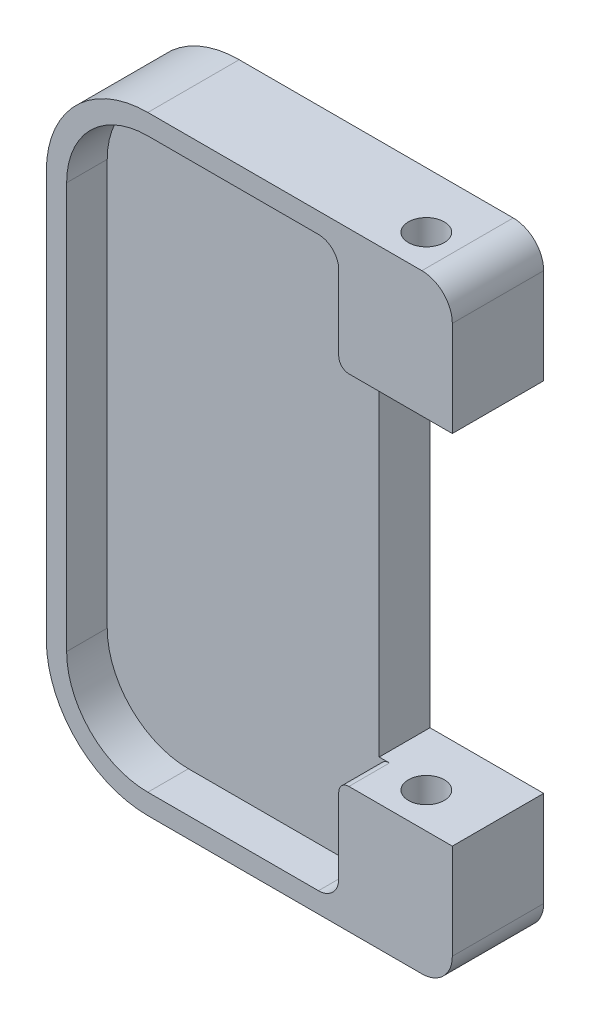
ISO-10303-21;
HEADER;
FILE_DESCRIPTION(('STEP AP214'),'2;1');
FILE_NAME('part.step','',(''),(''),'','','');
FILE_SCHEMA(('AUTOMOTIVE_DESIGN { 1 0 10303 214 1 1 1 1 }'));
ENDSEC;
DATA;
#1=APPLICATION_CONTEXT('core data for automotive mechanical design processes');
#2=APPLICATION_PROTOCOL_DEFINITION('international standard','automotive_design',2000,#1);
#3=PRODUCT_CONTEXT('',#1,'mechanical');
#4=PRODUCT('Part','Part','',(#3));
#5=PRODUCT_RELATED_PRODUCT_CATEGORY('part','',(#4));
#6=PRODUCT_DEFINITION_FORMATION('','',#4);
#7=PRODUCT_DEFINITION_CONTEXT('part definition',#1,'design');
#8=PRODUCT_DEFINITION('design','',#6,#7);
#9=PRODUCT_DEFINITION_SHAPE('','',#8);
#10=(LENGTH_UNIT() NAMED_UNIT(*) SI_UNIT(.MILLI.,.METRE.));
#11=(NAMED_UNIT(*) PLANE_ANGLE_UNIT() SI_UNIT($,.RADIAN.));
#12=(NAMED_UNIT(*) SI_UNIT($,.STERADIAN.) SOLID_ANGLE_UNIT());
#13=UNCERTAINTY_MEASURE_WITH_UNIT(LENGTH_MEASURE(1.E-05),#10,'distance_accuracy_value','');
#14=(GEOMETRIC_REPRESENTATION_CONTEXT(3) GLOBAL_UNCERTAINTY_ASSIGNED_CONTEXT((#13)) GLOBAL_UNIT_ASSIGNED_CONTEXT((#10,
#11,#12)) REPRESENTATION_CONTEXT('',''));
#15=CARTESIAN_POINT('',(0.,0.,0.));
#16=DIRECTION('',(0.,0.,1.));
#17=DIRECTION('',(1.,0.,0.));
#18=AXIS2_PLACEMENT_3D('',#15,#16,#17);
#19=CARTESIAN_POINT('',(0.,35.56,27.94));
#20=DIRECTION('',(0.,1.,0.));
#21=DIRECTION('',(0.,0.,1.));
#22=AXIS2_PLACEMENT_3D('',#19,#20,#21);
#23=PLANE('',#22);
#24=DIRECTION('',(-1.,0.,0.));
#25=VECTOR('',#24,1.);
#26=CARTESIAN_POINT('',(-76.2,35.56,25.4));
#27=LINE('',#26,#25);
#28=CARTESIAN_POINT('',(-54.8510226021288,35.56,25.4));
#29=VERTEX_POINT('',#28);
#30=CARTESIAN_POINT('',(-76.2,35.56,25.4));
#31=VERTEX_POINT('',#30);
#32=EDGE_CURVE('E304',#29,#31,#27,.T.);
#33=ORIENTED_EDGE('',*,*,#32,.F.);
#34=DIRECTION('',(0.,0.,-1.));
#35=VECTOR('',#34,1.);
#36=CARTESIAN_POINT('',(-54.8510226021288,35.56,30.48));
#37=LINE('',#36,#35);
#38=CARTESIAN_POINT('',(-54.8510226021288,35.56,30.48));
#39=VERTEX_POINT('',#38);
#40=EDGE_CURVE('E506',#29,#39,#37,.F.);
#41=ORIENTED_EDGE('',*,*,#40,.T.);
#42=DIRECTION('',(-1.,0.,0.));
#43=VECTOR('',#42,1.);
#44=CARTESIAN_POINT('',(0.,35.56,30.48));
#45=LINE('',#44,#43);
#46=CARTESIAN_POINT('',(-76.2,35.56,30.48));
#47=VERTEX_POINT('',#46);
#48=EDGE_CURVE('E399',#39,#47,#45,.T.);
#49=ORIENTED_EDGE('',*,*,#48,.T.);
#50=DIRECTION('',(0.,0.,1.));
#51=VECTOR('',#50,1.);
#52=CARTESIAN_POINT('',(-76.2,35.56,27.94));
#53=LINE('',#52,#51);
#54=EDGE_CURVE('E411',#31,#47,#53,.T.);
#55=ORIENTED_EDGE('',*,*,#54,.F.);
#56=EDGE_LOOP('',(#33,#41,#49,#55));
#57=FACE_BOUND('',#56,.T.);
#58=ADVANCED_FACE('F49',(#57),#23,.F.);
#59=CARTESIAN_POINT('',(-76.2,-25.4,25.4));
#60=DIRECTION('',(0.,0.,-1.));
#61=DIRECTION('',(-1.,0.,0.));
#62=AXIS2_PLACEMENT_3D('',#59,#60,#61);
#63=PLANE('',#62);
#64=DIRECTION('',(1.,0.,0.));
#65=VECTOR('',#64,1.);
#66=CARTESIAN_POINT('',(-50.9521226021288,-35.56,25.4));
#67=LINE('',#66,#65);
#68=CARTESIAN_POINT('',(-76.1999999999999,-35.56,25.4));
#69=VERTEX_POINT('',#68);
#70=CARTESIAN_POINT('',(-54.8510226021288,-35.56,25.4));
#71=VERTEX_POINT('',#70);
#72=EDGE_CURVE('E319',#69,#71,#67,.T.);
#73=ORIENTED_EDGE('',*,*,#72,.T.);
#74=CARTESIAN_POINT('',(-54.8510226021288,-33.02,25.4));
#75=DIRECTION('',(0.,0.,-1.));
#76=DIRECTION('',(-1.,0.,0.));
#77=AXIS2_PLACEMENT_3D('',#74,#75,#76);
#78=CIRCLE('',#77,2.54);
#79=CARTESIAN_POINT('',(-52.3110226021288,-33.02,25.4));
#80=VERTEX_POINT('',#79);
#81=EDGE_CURVE('E498',#71,#80,#78,.F.);
#82=ORIENTED_EDGE('',*,*,#81,.T.);
#83=DIRECTION('',(0.,-1.,0.));
#84=VECTOR('',#83,1.);
#85=CARTESIAN_POINT('',(-52.3110226021288,-22.352,25.4));
#86=LINE('',#85,#84);
#87=CARTESIAN_POINT('',(-52.3110226021288,-23.622,25.4));
#88=VERTEX_POINT('',#87);
#89=EDGE_CURVE('E540',#88,#80,#86,.T.);
#90=ORIENTED_EDGE('',*,*,#89,.F.);
#91=CARTESIAN_POINT('',(-51.0410226021288,-23.622,25.4));
#92=DIRECTION('',(0.,0.,-1.));
#93=DIRECTION('',(-1.,0.,0.));
#94=AXIS2_PLACEMENT_3D('',#91,#92,#93);
#95=CIRCLE('',#94,1.27);
#96=CARTESIAN_POINT('',(-51.0410226021288,-22.352,25.4));
#97=VERTEX_POINT('',#96);
#98=EDGE_CURVE('E58',#88,#97,#95,.T.);
#99=ORIENTED_EDGE('',*,*,#98,.T.);
#100=DIRECTION('',(-1.,0.,0.));
#101=VECTOR('',#100,1.);
#102=CARTESIAN_POINT('',(-50.9521226021288,-22.352,25.4));
#103=LINE('',#102,#101);
#104=CARTESIAN_POINT('',(-52.324,-22.352,25.4));
#105=VERTEX_POINT('',#104);
#106=EDGE_CURVE('E299',#97,#105,#103,.T.);
#107=ORIENTED_EDGE('',*,*,#106,.T.);
#108=DIRECTION('',(0.,-1.,0.));
#109=VECTOR('',#108,1.);
#110=CARTESIAN_POINT('',(-52.324,22.352,25.4));
#111=LINE('',#110,#109);
#112=CARTESIAN_POINT('',(-52.324,22.352,25.4));
#113=VERTEX_POINT('',#112);
#114=EDGE_CURVE('E289',#113,#105,#111,.T.);
#115=ORIENTED_EDGE('',*,*,#114,.F.);
#116=DIRECTION('',(1.,0.,0.));
#117=VECTOR('',#116,1.);
#118=CARTESIAN_POINT('',(-50.9521226021288,22.352,25.4));
#119=LINE('',#118,#117);
#120=CARTESIAN_POINT('',(-51.0410226021288,22.352,25.4));
#121=VERTEX_POINT('',#120);
#122=EDGE_CURVE('E64',#113,#121,#119,.T.);
#123=ORIENTED_EDGE('',*,*,#122,.T.);
#124=CARTESIAN_POINT('',(-51.0410226021288,23.622,25.4));
#125=DIRECTION('',(0.,0.,-1.));
#126=DIRECTION('',(-1.,0.,0.));
#127=AXIS2_PLACEMENT_3D('',#124,#125,#126);
#128=CIRCLE('',#127,1.27);
#129=CARTESIAN_POINT('',(-52.3110226021288,23.622,25.4));
#130=VERTEX_POINT('',#129);
#131=EDGE_CURVE('E12',#121,#130,#128,.T.);
#132=ORIENTED_EDGE('',*,*,#131,.T.);
#133=DIRECTION('',(0.,-1.,0.));
#134=VECTOR('',#133,1.);
#135=CARTESIAN_POINT('',(-52.3110226021288,35.56,25.4));
#136=LINE('',#135,#134);
#137=CARTESIAN_POINT('',(-52.3110226021288,33.02,25.4));
#138=VERTEX_POINT('',#137);
#139=EDGE_CURVE('E266',#138,#130,#136,.T.);
#140=ORIENTED_EDGE('',*,*,#139,.F.);
#141=CARTESIAN_POINT('',(-54.8510226021288,33.02,25.4));
#142=DIRECTION('',(0.,0.,-1.));
#143=DIRECTION('',(-1.,0.,0.));
#144=AXIS2_PLACEMENT_3D('',#141,#142,#143);
#145=CIRCLE('',#144,2.54);
#146=EDGE_CURVE('E495',#138,#29,#145,.F.);
#147=ORIENTED_EDGE('',*,*,#146,.T.);
#148=ORIENTED_EDGE('',*,*,#32,.T.);
#149=CARTESIAN_POINT('',(-76.2,25.4,25.4));
#150=DIRECTION('',(0.,0.,1.));
#151=DIRECTION('',(1.,0.,0.));
#152=AXIS2_PLACEMENT_3D('',#149,#150,#151);
#153=CIRCLE('',#152,10.16);
#154=CARTESIAN_POINT('',(-86.36,25.3999999999999,25.4));
#155=VERTEX_POINT('',#154);
#156=EDGE_CURVE('E307',#31,#155,#153,.T.);
#157=ORIENTED_EDGE('',*,*,#156,.T.);
#158=DIRECTION('',(0.,-1.,0.));
#159=VECTOR('',#158,1.);
#160=CARTESIAN_POINT('',(-86.36,25.3999999999999,25.4));
#161=LINE('',#160,#159);
#162=CARTESIAN_POINT('',(-86.36,-25.4,25.4));
#163=VERTEX_POINT('',#162);
#164=EDGE_CURVE('E311',#155,#163,#161,.T.);
#165=ORIENTED_EDGE('',*,*,#164,.T.);
#166=CARTESIAN_POINT('',(-76.2,-25.4,25.4));
#167=DIRECTION('',(0.,0.,1.));
#168=DIRECTION('',(-1.,0.,0.));
#169=AXIS2_PLACEMENT_3D('',#166,#167,#168);
#170=CIRCLE('',#169,10.16);
#171=EDGE_CURVE('E315',#163,#69,#170,.T.);
#172=ORIENTED_EDGE('',*,*,#171,.T.);
#173=EDGE_LOOP('',(#73,#82,#90,#99,#107,#115,#123,#132,#140,#147,#148,#157,#165,#172));
#174=FACE_BOUND('',#173,.T.);
#175=ADVANCED_FACE('F539',(#174),#63,.F.);
#176=CARTESIAN_POINT('',(0.,-22.352,21.59));
#177=DIRECTION('',(0.,1.,0.));
#178=DIRECTION('',(0.,0.,1.));
#179=AXIS2_PLACEMENT_3D('',#176,#177,#178);
#180=PLANE('',#179);
#181=ORIENTED_EDGE('',*,*,#106,.F.);
#182=DIRECTION('',(0.,0.,-1.));
#183=VECTOR('',#182,1.);
#184=CARTESIAN_POINT('',(-51.0410226021288,-22.352,21.59));
#185=LINE('',#184,#183);
#186=CARTESIAN_POINT('',(-51.0410226021288,-22.352,30.48));
#187=VERTEX_POINT('',#186);
#188=EDGE_CURVE('E520',#97,#187,#185,.F.);
#189=ORIENTED_EDGE('',*,*,#188,.T.);
#190=DIRECTION('',(-1.,0.,0.));
#191=VECTOR('',#190,1.);
#192=CARTESIAN_POINT('',(0.,-22.352,30.48));
#193=LINE('',#192,#191);
#194=CARTESIAN_POINT('',(-38.1,-22.352,30.48));
#195=VERTEX_POINT('',#194);
#196=EDGE_CURVE('E354',#195,#187,#193,.T.);
#197=ORIENTED_EDGE('',*,*,#196,.F.);
#198=DIRECTION('',(0.,0.,1.));
#199=VECTOR('',#198,1.);
#200=CARTESIAN_POINT('',(-38.1,-22.352,21.59));
#201=LINE('',#200,#199);
#202=CARTESIAN_POINT('',(-38.1,-22.352,19.05));
#203=VERTEX_POINT('',#202);
#204=EDGE_CURVE('E364',#203,#195,#201,.T.);
#205=ORIENTED_EDGE('',*,*,#204,.F.);
#206=DIRECTION('',(1.,0.,0.));
#207=VECTOR('',#206,1.);
#208=CARTESIAN_POINT('',(-52.324,-22.352,19.05));
#209=LINE('',#208,#207);
#210=CARTESIAN_POINT('',(-52.324,-22.352,19.05));
#211=VERTEX_POINT('',#210);
#212=EDGE_CURVE('E258',#211,#203,#209,.T.);
#213=ORIENTED_EDGE('',*,*,#212,.F.);
#214=DIRECTION('',(0.,0.,-1.));
#215=VECTOR('',#214,1.);
#216=CARTESIAN_POINT('',(-52.324,-22.352,25.4));
#217=LINE('',#216,#215);
#218=EDGE_CURVE('E293',#105,#211,#217,.T.);
#219=ORIENTED_EDGE('',*,*,#218,.F.);
#220=EDGE_LOOP('',(#181,#189,#197,#205,#213,#219));
#221=FACE_BOUND('',#220,.T.);
#222=CARTESIAN_POINT('',(-45.7960613010644,-22.352,26.035));
#223=DIRECTION('',(0.,1.,0.));
#224=DIRECTION('',(0.,0.,1.));
#225=AXIS2_PLACEMENT_3D('',#222,#223,#224);
#226=CIRCLE('',#225,2.2479);
#227=CARTESIAN_POINT('',(-45.7960613010644,-22.352,28.2829));
#228=VERTEX_POINT('',#227);
#229=EDGE_CURVE('E376',#228,#228,#226,.F.);
#230=ORIENTED_EDGE('',*,*,#229,.T.);
#231=EDGE_LOOP('',(#230));
#232=FACE_BOUND('',#231,.T.);
#233=ADVANCED_FACE('F546',(#221,#232),#180,.T.);
#234=CARTESIAN_POINT('',(0.,22.352,21.59));
#235=DIRECTION('',(0.,1.,0.));
#236=DIRECTION('',(-1.,0.,0.));
#237=AXIS2_PLACEMENT_3D('',#234,#235,#236);
#238=PLANE('',#237);
#239=DIRECTION('',(-1.,0.,0.));
#240=VECTOR('',#239,1.);
#241=CARTESIAN_POINT('',(0.,22.352,30.48));
#242=LINE('',#241,#240);
#243=CARTESIAN_POINT('',(-38.1,22.352,30.48));
#244=VERTEX_POINT('',#243);
#245=CARTESIAN_POINT('',(-51.0410226021288,22.352,30.48));
#246=VERTEX_POINT('',#245);
#247=EDGE_CURVE('E360',#244,#246,#242,.T.);
#248=ORIENTED_EDGE('',*,*,#247,.T.);
#249=DIRECTION('',(0.,0.,1.));
#250=VECTOR('',#249,1.);
#251=CARTESIAN_POINT('',(-51.0410226021288,22.352,21.59));
#252=LINE('',#251,#250);
#253=EDGE_CURVE('E533',#246,#121,#252,.F.);
#254=ORIENTED_EDGE('',*,*,#253,.T.);
#255=ORIENTED_EDGE('',*,*,#122,.F.);
#256=DIRECTION('',(0.,0.,1.));
#257=VECTOR('',#256,1.);
#258=CARTESIAN_POINT('',(-52.324,22.352,21.59));
#259=LINE('',#258,#257);
#260=CARTESIAN_POINT('',(-52.324,22.352,19.05));
#261=VERTEX_POINT('',#260);
#262=EDGE_CURVE('E286',#261,#113,#259,.T.);
#263=ORIENTED_EDGE('',*,*,#262,.F.);
#264=DIRECTION('',(-1.,0.,0.));
#265=VECTOR('',#264,1.);
#266=CARTESIAN_POINT('',(-38.1,22.352,19.05));
#267=LINE('',#266,#265);
#268=CARTESIAN_POINT('',(-38.1,22.352,19.05));
#269=VERTEX_POINT('',#268);
#270=EDGE_CURVE('E278',#269,#261,#267,.T.);
#271=ORIENTED_EDGE('',*,*,#270,.F.);
#272=DIRECTION('',(0.,0.,1.));
#273=VECTOR('',#272,1.);
#274=CARTESIAN_POINT('',(-38.1,22.352,21.59));
#275=LINE('',#274,#273);
#276=EDGE_CURVE('E365',#269,#244,#275,.T.);
#277=ORIENTED_EDGE('',*,*,#276,.T.);
#278=EDGE_LOOP('',(#248,#254,#255,#263,#271,#277));
#279=FACE_BOUND('',#278,.T.);
#280=CARTESIAN_POINT('',(-45.7960613010644,22.352,26.035));
#281=DIRECTION('',(0.,1.,0.));
#282=DIRECTION('',(-1.,0.,0.));
#283=AXIS2_PLACEMENT_3D('',#280,#281,#282);
#284=CIRCLE('',#283,2.2479);
#285=CARTESIAN_POINT('',(-48.0439613010644,22.352,26.035));
#286=VERTEX_POINT('',#285);
#287=EDGE_CURVE('E368',#286,#286,#284,.F.);
#288=ORIENTED_EDGE('',*,*,#287,.F.);
#289=EDGE_LOOP('',(#288));
#290=FACE_BOUND('',#289,.T.);
#291=ADVANCED_FACE('F761',(#279,#290),#238,.F.);
#292=CARTESIAN_POINT('',(-45.7960613010644,38.1,26.035));
#293=DIRECTION('',(0.,-1.,0.));
#294=DIRECTION('',(0.,0.,-1.));
#295=AXIS2_PLACEMENT_3D('',#292,#293,#294);
#296=CYLINDRICAL_SURFACE('',#295,2.2479);
#297=CARTESIAN_POINT('',(-45.7960613010644,38.1,26.035));
#298=DIRECTION('',(0.,-1.,0.));
#299=DIRECTION('',(0.,0.,-1.));
#300=AXIS2_PLACEMENT_3D('',#297,#298,#299);
#301=CIRCLE('',#300,2.2479);
#302=CARTESIAN_POINT('',(-45.7960613010644,38.1,23.7871));
#303=VERTEX_POINT('',#302);
#304=EDGE_CURVE('E371',#303,#303,#301,.T.);
#305=ORIENTED_EDGE('',*,*,#304,.F.);
#306=EDGE_LOOP('',(#305));
#307=FACE_BOUND('',#306,.T.);
#308=ORIENTED_EDGE('',*,*,#287,.T.);
#309=EDGE_LOOP('',(#308));
#310=FACE_BOUND('',#309,.T.);
#311=DIRECTION('',(0.,-1.,0.));
#312=VECTOR('',#311,1.);
#313=CARTESIAN_POINT('',(-44.602734267096,38.1,27.94));
#314=LINE('',#313,#312);
#315=CARTESIAN_POINT('',(-44.602734267096,24.765,27.94));
#316=VERTEX_POINT('',#315);
#317=CARTESIAN_POINT('',(-44.6027342670961,35.687,27.9400000000001));
#318=VERTEX_POINT('',#317);
#319=EDGE_CURVE('E454',#316,#318,#314,.F.);
#320=ORIENTED_EDGE('',*,*,#319,.T.);
#321=CARTESIAN_POINT('',(-45.7960613010644,35.687,26.035));
#322=DIRECTION('',(0.,-1.,0.));
#323=DIRECTION('',(1.,0.,0.));
#324=AXIS2_PLACEMENT_3D('',#321,#322,#323);
#325=CIRCLE('',#324,2.2479);
#326=CARTESIAN_POINT('',(-46.9893883350329,35.687,27.94));
#327=VERTEX_POINT('',#326);
#328=EDGE_CURVE('E484',#327,#318,#325,.F.);
#329=ORIENTED_EDGE('',*,*,#328,.F.);
#330=DIRECTION('',(0.,-1.,0.));
#331=VECTOR('',#330,1.);
#332=CARTESIAN_POINT('',(-46.9893883350329,38.1,27.94));
#333=LINE('',#332,#331);
#334=CARTESIAN_POINT('',(-46.9893883350329,24.765,27.94));
#335=VERTEX_POINT('',#334);
#336=EDGE_CURVE('E461',#327,#335,#333,.T.);
#337=ORIENTED_EDGE('',*,*,#336,.T.);
#338=CARTESIAN_POINT('',(-45.7960613010644,24.765,26.035));
#339=DIRECTION('',(0.,-1.,0.));
#340=DIRECTION('',(1.,0.,0.));
#341=AXIS2_PLACEMENT_3D('',#338,#339,#340);
#342=CIRCLE('',#341,2.2479);
#343=EDGE_CURVE('E375',#316,#335,#342,.T.);
#344=ORIENTED_EDGE('',*,*,#343,.F.);
#345=EDGE_LOOP('',(#320,#329,#337,#344));
#346=FACE_BOUND('',#345,.T.);
#347=ADVANCED_FACE('F560',(#307,#310,#346),#296,.F.);
#348=ORIENTED_EDGE('',*,*,#229,.F.);
#349=EDGE_LOOP('',(#348));
#350=FACE_BOUND('',#349,.T.);
#351=CARTESIAN_POINT('',(-45.7960613010644,-38.1,26.035));
#352=DIRECTION('',(0.,-1.,0.));
#353=DIRECTION('',(0.,0.,-1.));
#354=AXIS2_PLACEMENT_3D('',#351,#352,#353);
#355=CIRCLE('',#354,2.2479);
#356=CARTESIAN_POINT('',(-45.7960613010644,-38.1,23.7871));
#357=VERTEX_POINT('',#356);
#358=EDGE_CURVE('E384',#357,#357,#355,.T.);
#359=ORIENTED_EDGE('',*,*,#358,.T.);
#360=EDGE_LOOP('',(#359));
#361=FACE_BOUND('',#360,.T.);
#362=CARTESIAN_POINT('',(-46.9893883350329,-24.765,27.94));
#363=VERTEX_POINT('',#362);
#364=CARTESIAN_POINT('',(-46.9893883350329,-35.687,27.94));
#365=VERTEX_POINT('',#364);
#366=EDGE_CURVE('E458',#363,#365,#333,.T.);
#367=ORIENTED_EDGE('',*,*,#366,.T.);
#368=CARTESIAN_POINT('',(-45.7960613010644,-35.687,26.035));
#369=DIRECTION('',(0.,1.,0.));
#370=DIRECTION('',(-1.,0.,0.));
#371=AXIS2_PLACEMENT_3D('',#368,#369,#370);
#372=CIRCLE('',#371,2.2479);
#373=CARTESIAN_POINT('',(-44.6027342670959,-35.687,27.94));
#374=VERTEX_POINT('',#373);
#375=EDGE_CURVE('E474',#374,#365,#372,.F.);
#376=ORIENTED_EDGE('',*,*,#375,.F.);
#377=CARTESIAN_POINT('',(-44.602734267096,-24.765,27.94));
#378=VERTEX_POINT('',#377);
#379=EDGE_CURVE('E457',#374,#378,#314,.F.);
#380=ORIENTED_EDGE('',*,*,#379,.T.);
#381=CARTESIAN_POINT('',(-45.7960613010644,-24.765,26.035));
#382=DIRECTION('',(0.,1.,0.));
#383=DIRECTION('',(-1.,0.,0.));
#384=AXIS2_PLACEMENT_3D('',#381,#382,#383);
#385=CIRCLE('',#384,2.2479);
#386=EDGE_CURVE('E380',#363,#378,#385,.T.);
#387=ORIENTED_EDGE('',*,*,#386,.F.);
#388=EDGE_LOOP('',(#367,#376,#380,#387));
#389=FACE_BOUND('',#388,.T.);
#390=ADVANCED_FACE('F599',(#350,#361,#389),#296,.F.);
#391=CARTESIAN_POINT('',(0.,-35.56,27.94));
#392=DIRECTION('',(0.,-1.,0.));
#393=DIRECTION('',(0.,0.,-1.));
#394=AXIS2_PLACEMENT_3D('',#391,#392,#393);
#395=PLANE('',#394);
#396=DIRECTION('',(1.,0.,0.));
#397=VECTOR('',#396,1.);
#398=CARTESIAN_POINT('',(0.,-35.56,30.48));
#399=LINE('',#398,#397);
#400=CARTESIAN_POINT('',(-76.2,-35.56,30.48));
#401=VERTEX_POINT('',#400);
#402=CARTESIAN_POINT('',(-54.8510226021288,-35.56,30.48));
#403=VERTEX_POINT('',#402);
#404=EDGE_CURVE('E395',#401,#403,#399,.T.);
#405=ORIENTED_EDGE('',*,*,#404,.T.);
#406=DIRECTION('',(0.,0.,1.));
#407=VECTOR('',#406,1.);
#408=CARTESIAN_POINT('',(-54.8510226021288,-35.56,27.94));
#409=LINE('',#408,#407);
#410=EDGE_CURVE('E492',#403,#71,#409,.F.);
#411=ORIENTED_EDGE('',*,*,#410,.T.);
#412=ORIENTED_EDGE('',*,*,#72,.F.);
#413=DIRECTION('',(0.,0.,1.));
#414=VECTOR('',#413,1.);
#415=CARTESIAN_POINT('',(-76.2,-35.56,27.94));
#416=LINE('',#415,#414);
#417=EDGE_CURVE('E415',#69,#401,#416,.T.);
#418=ORIENTED_EDGE('',*,*,#417,.T.);
#419=EDGE_LOOP('',(#405,#411,#412,#418));
#420=FACE_BOUND('',#419,.T.);
#421=ADVANCED_FACE('F597',(#420),#395,.F.);
#422=CARTESIAN_POINT('',(-38.1,15.025000062,0.));
#423=DIRECTION('',(-1.,0.,0.));
#424=DIRECTION('',(0.,0.,1.));
#425=AXIS2_PLACEMENT_3D('',#422,#423,#424);
#426=PLANE('',#425);
#427=ORIENTED_EDGE('',*,*,#204,.T.);
#428=DIRECTION('',(0.,-1.,0.));
#429=VECTOR('',#428,1.);
#430=CARTESIAN_POINT('',(-38.1,0.,30.48));
#431=LINE('',#430,#429);
#432=CARTESIAN_POINT('',(-38.1,-34.29,30.48));
#433=VERTEX_POINT('',#432);
#434=EDGE_CURVE('E241',#195,#433,#431,.T.);
#435=ORIENTED_EDGE('',*,*,#434,.T.);
#436=DIRECTION('',(0.,0.,-1.));
#437=VECTOR('',#436,1.);
#438=CARTESIAN_POINT('',(-38.1,-34.29,21.59));
#439=LINE('',#438,#437);
#440=CARTESIAN_POINT('',(-38.1,-34.29,19.05));
#441=VERTEX_POINT('',#440);
#442=EDGE_CURVE('E234',#433,#441,#439,.T.);
#443=ORIENTED_EDGE('',*,*,#442,.T.);
#444=DIRECTION('',(0.,-1.,0.));
#445=VECTOR('',#444,1.);
#446=CARTESIAN_POINT('',(-38.1,-22.352,19.05));
#447=LINE('',#446,#445);
#448=EDGE_CURVE('E239',#203,#441,#447,.T.);
#449=ORIENTED_EDGE('',*,*,#448,.F.);
#450=EDGE_LOOP('',(#427,#435,#443,#449));
#451=FACE_BOUND('',#450,.T.);
#452=ADVANCED_FACE('F237',(#451),#426,.F.);
#453=CARTESIAN_POINT('',(0.,0.,30.48));
#454=DIRECTION('',(0.,0.,1.));
#455=DIRECTION('',(1.,0.,0.));
#456=AXIS2_PLACEMENT_3D('',#453,#454,#455);
#457=PLANE('',#456);
#458=ORIENTED_EDGE('',*,*,#196,.T.);
#459=CARTESIAN_POINT('',(-51.0410226021288,-23.622,30.48));
#460=DIRECTION('',(0.,0.,1.));
#461=DIRECTION('',(1.,0.,0.));
#462=AXIS2_PLACEMENT_3D('',#459,#460,#461);
#463=CIRCLE('',#462,1.27);
#464=CARTESIAN_POINT('',(-52.3110226021288,-23.622,30.48));
#465=VERTEX_POINT('',#464);
#466=EDGE_CURVE('E526',#187,#465,#463,.T.);
#467=ORIENTED_EDGE('',*,*,#466,.T.);
#468=DIRECTION('',(0.,1.,0.));
#469=VECTOR('',#468,1.);
#470=CARTESIAN_POINT('',(-52.3110226021288,-22.352,30.48));
#471=LINE('',#470,#469);
#472=CARTESIAN_POINT('',(-52.3110226021288,-33.02,30.48));
#473=VERTEX_POINT('',#472);
#474=EDGE_CURVE('E669',#473,#465,#471,.T.);
#475=ORIENTED_EDGE('',*,*,#474,.F.);
#476=CARTESIAN_POINT('',(-54.8510226021288,-33.02,30.48));
#477=DIRECTION('',(0.,0.,1.));
#478=DIRECTION('',(1.,0.,0.));
#479=AXIS2_PLACEMENT_3D('',#476,#477,#478);
#480=CIRCLE('',#479,2.54);
#481=EDGE_CURVE('E509',#473,#403,#480,.F.);
#482=ORIENTED_EDGE('',*,*,#481,.T.);
#483=ORIENTED_EDGE('',*,*,#404,.F.);
#484=CARTESIAN_POINT('',(-76.2,-25.4,30.48));
#485=DIRECTION('',(0.,0.,1.));
#486=DIRECTION('',(1.,0.,0.));
#487=AXIS2_PLACEMENT_3D('',#484,#485,#486);
#488=CIRCLE('',#487,10.16);
#489=CARTESIAN_POINT('',(-86.36,-25.4,30.48));
#490=VERTEX_POINT('',#489);
#491=EDGE_CURVE('E391',#490,#401,#488,.T.);
#492=ORIENTED_EDGE('',*,*,#491,.F.);
#493=DIRECTION('',(0.,-1.,0.));
#494=VECTOR('',#493,1.);
#495=CARTESIAN_POINT('',(-86.36,0.,30.48));
#496=LINE('',#495,#494);
#497=CARTESIAN_POINT('',(-86.36,25.4,30.48));
#498=VERTEX_POINT('',#497);
#499=EDGE_CURVE('E388',#498,#490,#496,.T.);
#500=ORIENTED_EDGE('',*,*,#499,.F.);
#501=CARTESIAN_POINT('',(-76.2,25.4,30.48));
#502=DIRECTION('',(0.,0.,1.));
#503=DIRECTION('',(1.,0.,0.));
#504=AXIS2_PLACEMENT_3D('',#501,#502,#503);
#505=CIRCLE('',#504,10.16);
#506=EDGE_CURVE('E402',#47,#498,#505,.T.);
#507=ORIENTED_EDGE('',*,*,#506,.F.);
#508=ORIENTED_EDGE('',*,*,#48,.F.);
#509=CARTESIAN_POINT('',(-54.8510226021288,33.02,30.48));
#510=DIRECTION('',(0.,0.,1.));
#511=DIRECTION('',(1.,0.,0.));
#512=AXIS2_PLACEMENT_3D('',#509,#510,#511);
#513=CIRCLE('',#512,2.54);
#514=CARTESIAN_POINT('',(-52.3110226021288,33.02,30.48));
#515=VERTEX_POINT('',#514);
#516=EDGE_CURVE('E512',#39,#515,#513,.F.);
#517=ORIENTED_EDGE('',*,*,#516,.T.);
#518=DIRECTION('',(0.,1.,0.));
#519=VECTOR('',#518,1.);
#520=CARTESIAN_POINT('',(-52.3110226021288,35.56,30.48));
#521=LINE('',#520,#519);
#522=CARTESIAN_POINT('',(-52.3110226021288,23.622,30.48));
#523=VERTEX_POINT('',#522);
#524=EDGE_CURVE('E271',#523,#515,#521,.T.);
#525=ORIENTED_EDGE('',*,*,#524,.F.);
#526=CARTESIAN_POINT('',(-51.0410226021288,23.622,30.48));
#527=DIRECTION('',(0.,0.,1.));
#528=DIRECTION('',(1.,0.,0.));
#529=AXIS2_PLACEMENT_3D('',#526,#527,#528);
#530=CIRCLE('',#529,1.27);
#531=EDGE_CURVE('E523',#523,#246,#530,.T.);
#532=ORIENTED_EDGE('',*,*,#531,.T.);
#533=ORIENTED_EDGE('',*,*,#247,.F.);
#534=CARTESIAN_POINT('',(-38.1,34.29,30.48));
#535=VERTEX_POINT('',#534);
#536=EDGE_CURVE('E431',#535,#244,#431,.T.);
#537=ORIENTED_EDGE('',*,*,#536,.F.);
#538=CARTESIAN_POINT('',(-41.91,34.29,30.48));
#539=DIRECTION('',(0.,0.,1.));
#540=DIRECTION('',(1.,0.,0.));
#541=AXIS2_PLACEMENT_3D('',#538,#539,#540);
#542=CIRCLE('',#541,3.81);
#543=CARTESIAN_POINT('',(-41.91,38.1,30.48));
#544=VERTEX_POINT('',#543);
#545=EDGE_CURVE('E469',#535,#544,#542,.T.);
#546=ORIENTED_EDGE('',*,*,#545,.T.);
#547=DIRECTION('',(1.,0.,0.));
#548=VECTOR('',#547,1.);
#549=CARTESIAN_POINT('',(-38.1,38.1,30.48));
#550=LINE('',#549,#548);
#551=CARTESIAN_POINT('',(-76.2,38.1,30.48));
#552=VERTEX_POINT('',#551);
#553=EDGE_CURVE('E424',#552,#544,#550,.T.);
#554=ORIENTED_EDGE('',*,*,#553,.F.);
#555=CARTESIAN_POINT('',(-76.2,25.4,30.48));
#556=DIRECTION('',(0.,0.,1.));
#557=DIRECTION('',(1.,0.,0.));
#558=AXIS2_PLACEMENT_3D('',#555,#556,#557);
#559=CIRCLE('',#558,12.7);
#560=CARTESIAN_POINT('',(-88.9,25.4,30.48));
#561=VERTEX_POINT('',#560);
#562=EDGE_CURVE('E444',#552,#561,#559,.T.);
#563=ORIENTED_EDGE('',*,*,#562,.T.);
#564=DIRECTION('',(0.,1.,0.));
#565=VECTOR('',#564,1.);
#566=CARTESIAN_POINT('',(-88.9,38.1,30.48));
#567=LINE('',#566,#565);
#568=CARTESIAN_POINT('',(-88.9,-25.4,30.48));
#569=VERTEX_POINT('',#568);
#570=EDGE_CURVE('E410',#569,#561,#567,.T.);
#571=ORIENTED_EDGE('',*,*,#570,.F.);
#572=CARTESIAN_POINT('',(-76.2,-25.4,30.48));
#573=DIRECTION('',(0.,0.,1.));
#574=DIRECTION('',(1.,0.,0.));
#575=AXIS2_PLACEMENT_3D('',#572,#573,#574);
#576=CIRCLE('',#575,12.7);
#577=CARTESIAN_POINT('',(-76.2,-38.1,30.48));
#578=VERTEX_POINT('',#577);
#579=EDGE_CURVE('E447',#569,#578,#576,.T.);
#580=ORIENTED_EDGE('',*,*,#579,.T.);
#581=DIRECTION('',(-1.,0.,0.));
#582=VECTOR('',#581,1.);
#583=CARTESIAN_POINT('',(-38.1,-38.1,30.48));
#584=LINE('',#583,#582);
#585=CARTESIAN_POINT('',(-41.91,-38.1,30.48));
#586=VERTEX_POINT('',#585);
#587=EDGE_CURVE('E428',#586,#578,#584,.T.);
#588=ORIENTED_EDGE('',*,*,#587,.F.);
#589=CARTESIAN_POINT('',(-41.91,-34.29,30.48));
#590=DIRECTION('',(0.,0.,1.));
#591=DIRECTION('',(1.,0.,0.));
#592=AXIS2_PLACEMENT_3D('',#589,#590,#591);
#593=CIRCLE('',#592,3.81);
#594=EDGE_CURVE('E466',#586,#433,#593,.T.);
#595=ORIENTED_EDGE('',*,*,#594,.T.);
#596=ORIENTED_EDGE('',*,*,#434,.F.);
#597=EDGE_LOOP('',(#458,#467,#475,#482,#483,#492,#500,#507,#508,#517,#525,#532,#533,#537,#546,
#554,#563,#571,#580,#588,#595,#596));
#598=FACE_BOUND('',#597,.T.);
#599=ADVANCED_FACE('F550',(#598),#457,.T.);
#600=ORIENTED_EDGE('',*,*,#536,.T.);
#601=ORIENTED_EDGE('',*,*,#276,.F.);
#602=DIRECTION('',(0.,-1.,0.));
#603=VECTOR('',#602,1.);
#604=CARTESIAN_POINT('',(-38.1,22.352,19.05));
#605=LINE('',#604,#603);
#606=CARTESIAN_POINT('',(-38.1,34.29,19.05));
#607=VERTEX_POINT('',#606);
#608=EDGE_CURVE('E257',#607,#269,#605,.T.);
#609=ORIENTED_EDGE('',*,*,#608,.F.);
#610=DIRECTION('',(0.,0.,-1.));
#611=VECTOR('',#610,1.);
#612=CARTESIAN_POINT('',(-38.1,34.29,30.48));
#613=LINE('',#612,#611);
#614=EDGE_CURVE('E246',#607,#535,#613,.F.);
#615=ORIENTED_EDGE('',*,*,#614,.T.);
#616=EDGE_LOOP('',(#600,#601,#609,#615));
#617=FACE_BOUND('',#616,.T.);
#618=ADVANCED_FACE('F623',(#617),#426,.F.);
#619=CARTESIAN_POINT('',(-88.9,38.1,30.48));
#620=DIRECTION('',(-1.,0.,0.));
#621=DIRECTION('',(0.,0.,1.));
#622=AXIS2_PLACEMENT_3D('',#619,#620,#621);
#623=PLANE('',#622);
#624=DIRECTION('',(0.,0.,-1.));
#625=VECTOR('',#624,1.);
#626=CARTESIAN_POINT('',(-88.9,25.4,30.48));
#627=LINE('',#626,#625);
#628=CARTESIAN_POINT('',(-88.9,25.4,19.05));
#629=VERTEX_POINT('',#628);
#630=EDGE_CURVE('E438',#561,#629,#627,.T.);
#631=ORIENTED_EDGE('',*,*,#630,.T.);
#632=DIRECTION('',(0.,1.,0.));
#633=VECTOR('',#632,1.);
#634=CARTESIAN_POINT('',(-88.9,-25.4,19.05));
#635=LINE('',#634,#633);
#636=CARTESIAN_POINT('',(-88.9,-25.4,19.05));
#637=VERTEX_POINT('',#636);
#638=EDGE_CURVE('E330',#637,#629,#635,.T.);
#639=ORIENTED_EDGE('',*,*,#638,.F.);
#640=DIRECTION('',(0.,0.,-1.));
#641=VECTOR('',#640,1.);
#642=CARTESIAN_POINT('',(-88.9,-25.4,30.48));
#643=LINE('',#642,#641);
#644=EDGE_CURVE('E441',#637,#569,#643,.F.);
#645=ORIENTED_EDGE('',*,*,#644,.T.);
#646=ORIENTED_EDGE('',*,*,#570,.T.);
#647=EDGE_LOOP('',(#631,#639,#645,#646));
#648=FACE_BOUND('',#647,.T.);
#649=ADVANCED_FACE('F615',(#648),#623,.T.);
#650=CARTESIAN_POINT('',(-38.1,-38.1,30.48));
#651=DIRECTION('',(0.,-1.,0.));
#652=DIRECTION('',(0.,0.,-1.));
#653=AXIS2_PLACEMENT_3D('',#650,#651,#652);
#654=PLANE('',#653);
#655=ORIENTED_EDGE('',*,*,#358,.F.);
#656=EDGE_LOOP('',(#655));
#657=FACE_BOUND('',#656,.T.);
#658=DIRECTION('',(-1.,0.,0.));
#659=VECTOR('',#658,1.);
#660=CARTESIAN_POINT('',(-53.467,-38.1,19.05));
#661=LINE('',#660,#659);
#662=CARTESIAN_POINT('',(-41.91,-38.1,19.05));
#663=VERTEX_POINT('',#662);
#664=CARTESIAN_POINT('',(-76.2,-38.1,19.05));
#665=VERTEX_POINT('',#664);
#666=EDGE_CURVE('E323',#663,#665,#661,.T.);
#667=ORIENTED_EDGE('',*,*,#666,.F.);
#668=DIRECTION('',(0.,0.,-1.));
#669=VECTOR('',#668,1.);
#670=CARTESIAN_POINT('',(-41.91,-38.1,30.48));
#671=LINE('',#670,#669);
#672=EDGE_CURVE('E252',#663,#586,#671,.F.);
#673=ORIENTED_EDGE('',*,*,#672,.T.);
#674=ORIENTED_EDGE('',*,*,#587,.T.);
#675=DIRECTION('',(0.,0.,-1.));
#676=VECTOR('',#675,1.);
#677=CARTESIAN_POINT('',(-76.2,-38.1,30.48));
#678=LINE('',#677,#676);
#679=EDGE_CURVE('E435',#578,#665,#678,.T.);
#680=ORIENTED_EDGE('',*,*,#679,.T.);
#681=EDGE_LOOP('',(#667,#673,#674,#680));
#682=FACE_BOUND('',#681,.T.);
#683=ADVANCED_FACE('F611',(#657,#682),#654,.T.);
#684=CARTESIAN_POINT('',(-38.1,38.1,30.48));
#685=DIRECTION('',(0.,1.,0.));
#686=DIRECTION('',(0.,0.,1.));
#687=AXIS2_PLACEMENT_3D('',#684,#685,#686);
#688=PLANE('',#687);
#689=DIRECTION('',(0.,0.,-1.));
#690=VECTOR('',#689,1.);
#691=CARTESIAN_POINT('',(-41.91,38.1,21.59));
#692=LINE('',#691,#690);
#693=CARTESIAN_POINT('',(-41.91,38.1,19.05));
#694=VERTEX_POINT('',#693);
#695=EDGE_CURVE('E247',#544,#694,#692,.T.);
#696=ORIENTED_EDGE('',*,*,#695,.T.);
#697=DIRECTION('',(1.,0.,0.));
#698=VECTOR('',#697,1.);
#699=CARTESIAN_POINT('',(-53.467,38.1,19.05));
#700=LINE('',#699,#698);
#701=CARTESIAN_POINT('',(-76.2,38.1,19.05));
#702=VERTEX_POINT('',#701);
#703=EDGE_CURVE('E338',#702,#694,#700,.T.);
#704=ORIENTED_EDGE('',*,*,#703,.F.);
#705=DIRECTION('',(0.,0.,-1.));
#706=VECTOR('',#705,1.);
#707=CARTESIAN_POINT('',(-76.2,38.1,30.48));
#708=LINE('',#707,#706);
#709=EDGE_CURVE('E451',#702,#552,#708,.F.);
#710=ORIENTED_EDGE('',*,*,#709,.T.);
#711=ORIENTED_EDGE('',*,*,#553,.T.);
#712=EDGE_LOOP('',(#696,#704,#710,#711));
#713=FACE_BOUND('',#712,.T.);
#714=ORIENTED_EDGE('',*,*,#304,.T.);
#715=EDGE_LOOP('',(#714));
#716=FACE_BOUND('',#715,.T.);
#717=ADVANCED_FACE('F614',(#713,#716),#688,.T.);
#718=CARTESIAN_POINT('',(-76.2,-25.4,30.48));
#719=DIRECTION('',(0.,0.,-1.));
#720=DIRECTION('',(-1.,0.,0.));
#721=AXIS2_PLACEMENT_3D('',#718,#719,#720);
#722=CYLINDRICAL_SURFACE('',#721,12.7);
#723=ORIENTED_EDGE('',*,*,#579,.F.);
#724=ORIENTED_EDGE('',*,*,#644,.F.);
#725=CARTESIAN_POINT('',(-76.2,-25.4,19.05));
#726=DIRECTION('',(0.,0.,-1.));
#727=DIRECTION('',(1.,0.,0.));
#728=AXIS2_PLACEMENT_3D('',#725,#726,#727);
#729=CIRCLE('',#728,12.7);
#730=EDGE_CURVE('E326',#665,#637,#729,.T.);
#731=ORIENTED_EDGE('',*,*,#730,.F.);
#732=ORIENTED_EDGE('',*,*,#679,.F.);
#733=EDGE_LOOP('',(#723,#724,#731,#732));
#734=FACE_BOUND('',#733,.T.);
#735=ADVANCED_FACE('F619',(#734),#722,.T.);
#736=CARTESIAN_POINT('',(-76.2,25.4,30.48));
#737=DIRECTION('',(0.,0.,-1.));
#738=DIRECTION('',(-1.,0.,0.));
#739=AXIS2_PLACEMENT_3D('',#736,#737,#738);
#740=CYLINDRICAL_SURFACE('',#739,12.7);
#741=ORIENTED_EDGE('',*,*,#562,.F.);
#742=ORIENTED_EDGE('',*,*,#709,.F.);
#743=CARTESIAN_POINT('',(-76.2,25.3999999999999,19.05));
#744=DIRECTION('',(0.,0.,-1.));
#745=DIRECTION('',(1.,0.,0.));
#746=AXIS2_PLACEMENT_3D('',#743,#744,#745);
#747=CIRCLE('',#746,12.7000000000001);
#748=EDGE_CURVE('E334',#629,#702,#747,.T.);
#749=ORIENTED_EDGE('',*,*,#748,.F.);
#750=ORIENTED_EDGE('',*,*,#630,.F.);
#751=EDGE_LOOP('',(#741,#742,#749,#750));
#752=FACE_BOUND('',#751,.T.);
#753=ADVANCED_FACE('F609',(#752),#740,.T.);
#754=CARTESIAN_POINT('',(-86.36,0.,27.94));
#755=DIRECTION('',(-1.,0.,0.));
#756=DIRECTION('',(0.,0.,1.));
#757=AXIS2_PLACEMENT_3D('',#754,#755,#756);
#758=PLANE('',#757);
#759=ORIENTED_EDGE('',*,*,#499,.T.);
#760=DIRECTION('',(0.,0.,1.));
#761=VECTOR('',#760,1.);
#762=CARTESIAN_POINT('',(-86.36,-25.4,27.94));
#763=LINE('',#762,#761);
#764=EDGE_CURVE('E406',#163,#490,#763,.T.);
#765=ORIENTED_EDGE('',*,*,#764,.F.);
#766=ORIENTED_EDGE('',*,*,#164,.F.);
#767=DIRECTION('',(0.,0.,1.));
#768=VECTOR('',#767,1.);
#769=CARTESIAN_POINT('',(-86.36,25.4,27.94));
#770=LINE('',#769,#768);
#771=EDGE_CURVE('E407',#155,#498,#770,.T.);
#772=ORIENTED_EDGE('',*,*,#771,.T.);
#773=EDGE_LOOP('',(#759,#765,#766,#772));
#774=FACE_BOUND('',#773,.T.);
#775=ADVANCED_FACE('F606',(#774),#758,.F.);
#776=CARTESIAN_POINT('',(-76.2,25.4,27.94));
#777=DIRECTION('',(0.,0.,1.));
#778=DIRECTION('',(1.,0.,0.));
#779=AXIS2_PLACEMENT_3D('',#776,#777,#778);
#780=CYLINDRICAL_SURFACE('',#779,10.16);
#781=ORIENTED_EDGE('',*,*,#506,.T.);
#782=ORIENTED_EDGE('',*,*,#771,.F.);
#783=ORIENTED_EDGE('',*,*,#156,.F.);
#784=ORIENTED_EDGE('',*,*,#54,.T.);
#785=EDGE_LOOP('',(#781,#782,#783,#784));
#786=FACE_BOUND('',#785,.T.);
#787=ADVANCED_FACE('F595',(#786),#780,.F.);
#788=CARTESIAN_POINT('',(-76.2,-25.4,27.94));
#789=DIRECTION('',(0.,0.,1.));
#790=DIRECTION('',(1.,0.,0.));
#791=AXIS2_PLACEMENT_3D('',#788,#789,#790);
#792=CYLINDRICAL_SURFACE('',#791,10.16);
#793=ORIENTED_EDGE('',*,*,#491,.T.);
#794=ORIENTED_EDGE('',*,*,#417,.F.);
#795=ORIENTED_EDGE('',*,*,#171,.F.);
#796=ORIENTED_EDGE('',*,*,#764,.T.);
#797=EDGE_LOOP('',(#793,#794,#795,#796));
#798=FACE_BOUND('',#797,.T.);
#799=ADVANCED_FACE('F601',(#798),#792,.F.);
#800=CARTESIAN_POINT('',(-41.91,34.29,30.48));
#801=DIRECTION('',(0.,0.,1.));
#802=DIRECTION('',(1.,0.,0.));
#803=AXIS2_PLACEMENT_3D('',#800,#801,#802);
#804=CYLINDRICAL_SURFACE('',#803,3.81);
#805=ORIENTED_EDGE('',*,*,#545,.F.);
#806=ORIENTED_EDGE('',*,*,#614,.F.);
#807=CARTESIAN_POINT('',(-41.91,34.29,19.05));
#808=DIRECTION('',(0.,0.,-1.));
#809=DIRECTION('',(1.,0.,0.));
#810=AXIS2_PLACEMENT_3D('',#807,#808,#809);
#811=CIRCLE('',#810,3.81);
#812=EDGE_CURVE('E282',#694,#607,#811,.T.);
#813=ORIENTED_EDGE('',*,*,#812,.F.);
#814=ORIENTED_EDGE('',*,*,#695,.F.);
#815=EDGE_LOOP('',(#805,#806,#813,#814));
#816=FACE_BOUND('',#815,.T.);
#817=ADVANCED_FACE('F604',(#816),#804,.T.);
#818=CARTESIAN_POINT('',(-41.91,-34.29,0.));
#819=DIRECTION('',(0.,0.,1.));
#820=DIRECTION('',(1.,0.,0.));
#821=AXIS2_PLACEMENT_3D('',#818,#819,#820);
#822=CYLINDRICAL_SURFACE('',#821,3.81);
#823=ORIENTED_EDGE('',*,*,#594,.F.);
#824=ORIENTED_EDGE('',*,*,#672,.F.);
#825=CARTESIAN_POINT('',(-41.91,-34.29,19.05));
#826=DIRECTION('',(0.,0.,-1.));
#827=DIRECTION('',(-1.,0.,0.));
#828=AXIS2_PLACEMENT_3D('',#825,#826,#827);
#829=CIRCLE('',#828,3.81000000000002);
#830=EDGE_CURVE('E250',#441,#663,#829,.T.);
#831=ORIENTED_EDGE('',*,*,#830,.F.);
#832=ORIENTED_EDGE('',*,*,#442,.F.);
#833=EDGE_LOOP('',(#823,#824,#831,#832));
#834=FACE_BOUND('',#833,.T.);
#835=ADVANCED_FACE('F251',(#834),#822,.T.);
#836=CARTESIAN_POINT('',(-45.7960613010644,-35.687,25.842730444125));
#837=DIRECTION('',(0.,1.,0.));
#838=DIRECTION('',(-1.,0.,0.));
#839=AXIS2_PLACEMENT_3D('',#836,#837,#838);
#840=PLANE('',#839);
#841=CARTESIAN_POINT('',(-45.7960613010644,-35.687,25.842730444125));
#842=DIRECTION('',(0.,1.,0.));
#843=DIRECTION('',(-1.,0.,0.));
#844=AXIS2_PLACEMENT_3D('',#841,#842,#843);
#845=CIRCLE('',#844,2.41300000000001);
#846=EDGE_CURVE('E350',#365,#374,#845,.T.);
#847=ORIENTED_EDGE('',*,*,#846,.T.);
#848=ORIENTED_EDGE('',*,*,#375,.T.);
#849=EDGE_LOOP('',(#847,#848));
#850=FACE_BOUND('',#849,.T.);
#851=ADVANCED_FACE('F641',(#850),#840,.F.);
#852=CARTESIAN_POINT('',(-45.7960613010644,-24.765,25.842730444125));
#853=DIRECTION('',(0.,1.,0.));
#854=DIRECTION('',(-1.,0.,0.));
#855=AXIS2_PLACEMENT_3D('',#852,#853,#854);
#856=PLANE('',#855);
#857=ORIENTED_EDGE('',*,*,#386,.T.);
#858=CARTESIAN_POINT('',(-45.7960613010644,-24.765,25.842730444125));
#859=DIRECTION('',(0.,1.,0.));
#860=DIRECTION('',(-1.,0.,0.));
#861=AXIS2_PLACEMENT_3D('',#858,#859,#860);
#862=CIRCLE('',#861,2.41300000000001);
#863=EDGE_CURVE('E346',#363,#378,#862,.T.);
#864=ORIENTED_EDGE('',*,*,#863,.F.);
#865=EDGE_LOOP('',(#857,#864));
#866=FACE_BOUND('',#865,.T.);
#867=ADVANCED_FACE('F579',(#866),#856,.T.);
#868=CARTESIAN_POINT('',(-45.7960613010644,-35.687,25.842730444125));
#869=DIRECTION('',(0.,1.,0.));
#870=DIRECTION('',(-1.,0.,0.));
#871=AXIS2_PLACEMENT_3D('',#868,#869,#870);
#872=CYLINDRICAL_SURFACE('',#871,2.41300000000001);
#873=ORIENTED_EDGE('',*,*,#863,.T.);
#874=ORIENTED_EDGE('',*,*,#379,.F.);
#875=ORIENTED_EDGE('',*,*,#846,.F.);
#876=ORIENTED_EDGE('',*,*,#366,.F.);
#877=EDGE_LOOP('',(#873,#874,#875,#876));
#878=FACE_BOUND('',#877,.T.);
#879=ADVANCED_FACE('F571',(#878),#872,.F.);
#880=CARTESIAN_POINT('',(-45.7960613010644,35.687,25.842730444125));
#881=DIRECTION('',(0.,-1.,0.));
#882=DIRECTION('',(1.,0.,0.));
#883=AXIS2_PLACEMENT_3D('',#880,#881,#882);
#884=PLANE('',#883);
#885=CARTESIAN_POINT('',(-45.7960613010644,35.687,25.842730444125));
#886=DIRECTION('',(0.,-1.,0.));
#887=DIRECTION('',(1.,0.,0.));
#888=AXIS2_PLACEMENT_3D('',#885,#886,#887);
#889=CIRCLE('',#888,2.41299999999999);
#890=EDGE_CURVE('E342',#318,#327,#889,.T.);
#891=ORIENTED_EDGE('',*,*,#890,.T.);
#892=ORIENTED_EDGE('',*,*,#328,.T.);
#893=EDGE_LOOP('',(#891,#892));
#894=FACE_BOUND('',#893,.T.);
#895=ADVANCED_FACE('F569',(#894),#884,.F.);
#896=CARTESIAN_POINT('',(-45.7960613010644,24.765,25.842730444125));
#897=DIRECTION('',(0.,-1.,0.));
#898=DIRECTION('',(1.,0.,0.));
#899=AXIS2_PLACEMENT_3D('',#896,#897,#898);
#900=PLANE('',#899);
#901=ORIENTED_EDGE('',*,*,#343,.T.);
#902=CARTESIAN_POINT('',(-45.7960613010644,24.765,25.842730444125));
#903=DIRECTION('',(0.,-1.,0.));
#904=DIRECTION('',(1.,0.,0.));
#905=AXIS2_PLACEMENT_3D('',#902,#903,#904);
#906=CIRCLE('',#905,2.41299999999999);
#907=EDGE_CURVE('E341',#316,#335,#906,.T.);
#908=ORIENTED_EDGE('',*,*,#907,.F.);
#909=EDGE_LOOP('',(#901,#908));
#910=FACE_BOUND('',#909,.T.);
#911=ADVANCED_FACE('F566',(#910),#900,.T.);
#912=CARTESIAN_POINT('',(-45.7960613010644,35.687,25.842730444125));
#913=DIRECTION('',(0.,-1.,0.));
#914=DIRECTION('',(1.,0.,0.));
#915=AXIS2_PLACEMENT_3D('',#912,#913,#914);
#916=CYLINDRICAL_SURFACE('',#915,2.41299999999999);
#917=ORIENTED_EDGE('',*,*,#907,.T.);
#918=ORIENTED_EDGE('',*,*,#336,.F.);
#919=ORIENTED_EDGE('',*,*,#890,.F.);
#920=ORIENTED_EDGE('',*,*,#319,.F.);
#921=EDGE_LOOP('',(#917,#918,#919,#920));
#922=FACE_BOUND('',#921,.T.);
#923=ADVANCED_FACE('F567',(#922),#916,.F.);
#924=CARTESIAN_POINT('',(-76.2,-25.4,19.05));
#925=DIRECTION('',(0.,0.,1.));
#926=DIRECTION('',(1.,0.,0.));
#927=AXIS2_PLACEMENT_3D('',#924,#925,#926);
#928=PLANE('',#927);
#929=ORIENTED_EDGE('',*,*,#703,.T.);
#930=ORIENTED_EDGE('',*,*,#812,.T.);
#931=ORIENTED_EDGE('',*,*,#608,.T.);
#932=ORIENTED_EDGE('',*,*,#270,.T.);
#933=DIRECTION('',(0.,1.,0.));
#934=VECTOR('',#933,1.);
#935=CARTESIAN_POINT('',(-52.324,38.1,19.05));
#936=LINE('',#935,#934);
#937=EDGE_CURVE('E296',#211,#261,#936,.T.);
#938=ORIENTED_EDGE('',*,*,#937,.F.);
#939=ORIENTED_EDGE('',*,*,#212,.T.);
#940=ORIENTED_EDGE('',*,*,#448,.T.);
#941=ORIENTED_EDGE('',*,*,#830,.T.);
#942=ORIENTED_EDGE('',*,*,#666,.T.);
#943=ORIENTED_EDGE('',*,*,#730,.T.);
#944=ORIENTED_EDGE('',*,*,#638,.T.);
#945=ORIENTED_EDGE('',*,*,#748,.T.);
#946=EDGE_LOOP('',(#929,#930,#931,#932,#938,#939,#940,#941,#942,#943,#944,#945));
#947=FACE_BOUND('',#946,.T.);
#948=ADVANCED_FACE('F262',(#947),#928,.F.);
#949=CARTESIAN_POINT('',(-52.324,0.,0.));
#950=DIRECTION('',(-1.,0.,0.));
#951=DIRECTION('',(0.,0.,1.));
#952=AXIS2_PLACEMENT_3D('',#949,#950,#951);
#953=PLANE('',#952);
#954=ORIENTED_EDGE('',*,*,#218,.T.);
#955=ORIENTED_EDGE('',*,*,#937,.T.);
#956=ORIENTED_EDGE('',*,*,#262,.T.);
#957=ORIENTED_EDGE('',*,*,#114,.T.);
#958=EDGE_LOOP('',(#954,#955,#956,#957));
#959=FACE_BOUND('',#958,.T.);
#960=ADVANCED_FACE('F738',(#959),#953,.F.);
#961=CARTESIAN_POINT('',(-52.3110226021288,0.,0.));
#962=DIRECTION('',(1.,0.,0.));
#963=DIRECTION('',(0.,0.,-1.));
#964=AXIS2_PLACEMENT_3D('',#961,#962,#963);
#965=PLANE('',#964);
#966=ORIENTED_EDGE('',*,*,#139,.T.);
#967=DIRECTION('',(0.,0.,1.));
#968=VECTOR('',#967,1.);
#969=CARTESIAN_POINT('',(-52.3110226021288,23.622,0.));
#970=LINE('',#969,#968);
#971=EDGE_CURVE('E529',#130,#523,#970,.T.);
#972=ORIENTED_EDGE('',*,*,#971,.T.);
#973=ORIENTED_EDGE('',*,*,#524,.T.);
#974=DIRECTION('',(0.,0.,-1.));
#975=VECTOR('',#974,1.);
#976=CARTESIAN_POINT('',(-52.3110226021288,33.02,25.4));
#977=LINE('',#976,#975);
#978=EDGE_CURVE('E502',#515,#138,#977,.T.);
#979=ORIENTED_EDGE('',*,*,#978,.T.);
#980=EDGE_LOOP('',(#966,#972,#973,#979));
#981=FACE_BOUND('',#980,.T.);
#982=ADVANCED_FACE('F662',(#981),#965,.F.);
#983=CARTESIAN_POINT('',(-52.3110226021288,0.,0.));
#984=DIRECTION('',(-1.,0.,0.));
#985=DIRECTION('',(0.,0.,1.));
#986=AXIS2_PLACEMENT_3D('',#983,#984,#985);
#987=PLANE('',#986);
#988=ORIENTED_EDGE('',*,*,#474,.T.);
#989=DIRECTION('',(0.,0.,-1.));
#990=VECTOR('',#989,1.);
#991=CARTESIAN_POINT('',(-52.3110226021288,-23.622,0.));
#992=LINE('',#991,#990);
#993=EDGE_CURVE('E516',#465,#88,#992,.T.);
#994=ORIENTED_EDGE('',*,*,#993,.T.);
#995=ORIENTED_EDGE('',*,*,#89,.T.);
#996=DIRECTION('',(0.,0.,1.));
#997=VECTOR('',#996,1.);
#998=CARTESIAN_POINT('',(-52.3110226021288,-33.02,0.));
#999=LINE('',#998,#997);
#1000=EDGE_CURVE('E488',#80,#473,#999,.T.);
#1001=ORIENTED_EDGE('',*,*,#1000,.T.);
#1002=EDGE_LOOP('',(#988,#994,#995,#1001));
#1003=FACE_BOUND('',#1002,.T.);
#1004=ADVANCED_FACE('F646',(#1003),#987,.T.);
#1005=CARTESIAN_POINT('',(-54.8510226021288,-33.02,0.));
#1006=DIRECTION('',(0.,0.,1.));
#1007=DIRECTION('',(1.,0.,0.));
#1008=AXIS2_PLACEMENT_3D('',#1005,#1006,#1007);
#1009=CYLINDRICAL_SURFACE('',#1008,2.54);
#1010=ORIENTED_EDGE('',*,*,#81,.F.);
#1011=ORIENTED_EDGE('',*,*,#410,.F.);
#1012=ORIENTED_EDGE('',*,*,#481,.F.);
#1013=ORIENTED_EDGE('',*,*,#1000,.F.);
#1014=EDGE_LOOP('',(#1010,#1011,#1012,#1013));
#1015=FACE_BOUND('',#1014,.T.);
#1016=ADVANCED_FACE('F642',(#1015),#1009,.F.);
#1017=CARTESIAN_POINT('',(-54.8510226021288,33.02,0.));
#1018=DIRECTION('',(0.,0.,1.));
#1019=DIRECTION('',(1.,0.,0.));
#1020=AXIS2_PLACEMENT_3D('',#1017,#1018,#1019);
#1021=CYLINDRICAL_SURFACE('',#1020,2.54);
#1022=ORIENTED_EDGE('',*,*,#516,.F.);
#1023=ORIENTED_EDGE('',*,*,#40,.F.);
#1024=ORIENTED_EDGE('',*,*,#146,.F.);
#1025=ORIENTED_EDGE('',*,*,#978,.F.);
#1026=EDGE_LOOP('',(#1022,#1023,#1024,#1025));
#1027=FACE_BOUND('',#1026,.T.);
#1028=ADVANCED_FACE('F645',(#1027),#1021,.F.);
#1029=CARTESIAN_POINT('',(-51.0410226021288,-23.622,0.));
#1030=DIRECTION('',(0.,0.,-1.));
#1031=DIRECTION('',(-1.,0.,0.));
#1032=AXIS2_PLACEMENT_3D('',#1029,#1030,#1031);
#1033=CYLINDRICAL_SURFACE('',#1032,1.27);
#1034=ORIENTED_EDGE('',*,*,#466,.F.);
#1035=ORIENTED_EDGE('',*,*,#188,.F.);
#1036=ORIENTED_EDGE('',*,*,#98,.F.);
#1037=ORIENTED_EDGE('',*,*,#993,.F.);
#1038=EDGE_LOOP('',(#1034,#1035,#1036,#1037));
#1039=FACE_BOUND('',#1038,.T.);
#1040=ADVANCED_FACE('F544',(#1039),#1033,.T.);
#1041=CARTESIAN_POINT('',(-51.0410226021288,23.622,0.));
#1042=DIRECTION('',(0.,0.,1.));
#1043=DIRECTION('',(1.,0.,0.));
#1044=AXIS2_PLACEMENT_3D('',#1041,#1042,#1043);
#1045=CYLINDRICAL_SURFACE('',#1044,1.27);
#1046=ORIENTED_EDGE('',*,*,#131,.F.);
#1047=ORIENTED_EDGE('',*,*,#253,.F.);
#1048=ORIENTED_EDGE('',*,*,#531,.F.);
#1049=ORIENTED_EDGE('',*,*,#971,.F.);
#1050=EDGE_LOOP('',(#1046,#1047,#1048,#1049));
#1051=FACE_BOUND('',#1050,.T.);
#1052=ADVANCED_FACE('F51',(#1051),#1045,.T.);
#1053=CLOSED_SHELL('',(#58,#175,#233,#291,#347,#390,#421,#452,#599,#618,#649,#683,#717,#735,
#753,#775,#787,#799,#817,#835,#851,#867,#879,#895,#911,#923,#948,#960,#982,#1004,#1016,#1028,
#1040,#1052));
#1054=MANIFOLD_SOLID_BREP('B2',#1053);
#1055=ADVANCED_BREP_SHAPE_REPRESENTATION('',(#18,#1054),#14);
#1056=SHAPE_DEFINITION_REPRESENTATION(#9,#1055);
ENDSEC;
END-ISO-10303-21;
